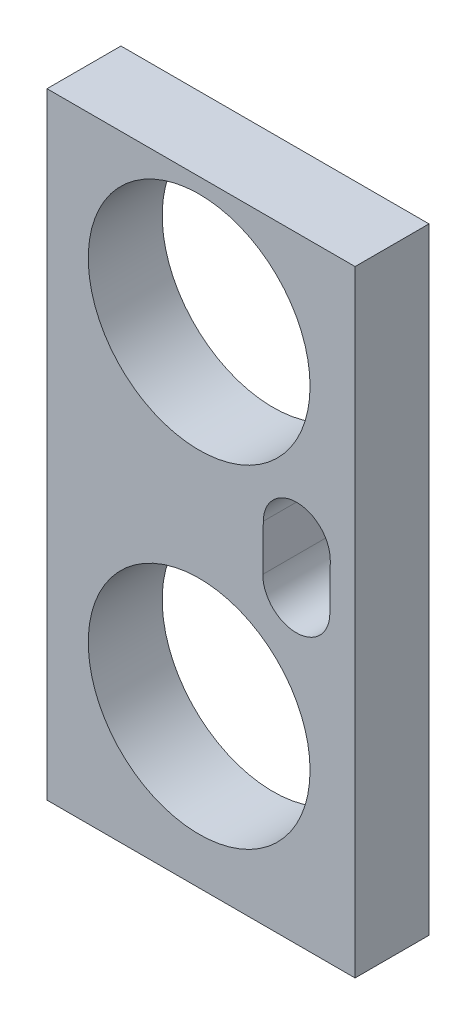
ISO-10303-21;
HEADER;
FILE_DESCRIPTION(('STEP AP214'),'2;1');
FILE_NAME('part.step','',(''),(''),'','','');
FILE_SCHEMA(('AUTOMOTIVE_DESIGN { 1 0 10303 214 1 1 1 1 }'));
ENDSEC;
DATA;
#1=APPLICATION_CONTEXT('core data for automotive mechanical design processes');
#2=APPLICATION_PROTOCOL_DEFINITION('international standard','automotive_design',2000,#1);
#3=PRODUCT_CONTEXT('',#1,'mechanical');
#4=PRODUCT('Part','Part','',(#3));
#5=PRODUCT_RELATED_PRODUCT_CATEGORY('part','',(#4));
#6=PRODUCT_DEFINITION_FORMATION('','',#4);
#7=PRODUCT_DEFINITION_CONTEXT('part definition',#1,'design');
#8=PRODUCT_DEFINITION('design','',#6,#7);
#9=PRODUCT_DEFINITION_SHAPE('','',#8);
#10=(LENGTH_UNIT() NAMED_UNIT(*) SI_UNIT(.MILLI.,.METRE.));
#11=(NAMED_UNIT(*) PLANE_ANGLE_UNIT() SI_UNIT($,.RADIAN.));
#12=(NAMED_UNIT(*) SI_UNIT($,.STERADIAN.) SOLID_ANGLE_UNIT());
#13=UNCERTAINTY_MEASURE_WITH_UNIT(LENGTH_MEASURE(1.E-05),#10,'distance_accuracy_value','');
#14=(GEOMETRIC_REPRESENTATION_CONTEXT(3) GLOBAL_UNCERTAINTY_ASSIGNED_CONTEXT((#13)) GLOBAL_UNIT_ASSIGNED_CONTEXT((#10,
#11,#12)) REPRESENTATION_CONTEXT('',''));
#15=CARTESIAN_POINT('',(0.,0.,0.));
#16=DIRECTION('',(0.,0.,1.));
#17=DIRECTION('',(1.,0.,0.));
#18=AXIS2_PLACEMENT_3D('',#15,#16,#17);
#19=CARTESIAN_POINT('',(-15.7894736842105,18.640350877193,6.));
#20=DIRECTION('',(1.,0.,0.));
#21=DIRECTION('',(0.,1.,0.));
#22=AXIS2_PLACEMENT_3D('',#19,#20,#21);
#23=PLANE('',#22);
#24=DIRECTION('',(0.,-1.,0.));
#25=VECTOR('',#24,1.);
#26=CARTESIAN_POINT('',(-15.7894736842105,18.640350877193,0.));
#27=LINE('',#26,#25);
#28=CARTESIAN_POINT('',(-15.7894736842105,18.640350877193,0.));
#29=VERTEX_POINT('',#28);
#30=CARTESIAN_POINT('',(-15.7894736842105,-31.359649122807,0.));
#31=VERTEX_POINT('',#30);
#32=EDGE_CURVE('E159',#29,#31,#27,.T.);
#33=ORIENTED_EDGE('',*,*,#32,.T.);
#34=DIRECTION('',(0.,0.,-1.));
#35=VECTOR('',#34,1.);
#36=CARTESIAN_POINT('',(-15.7894736842105,-31.359649122807,6.));
#37=LINE('',#36,#35);
#38=CARTESIAN_POINT('',(-15.7894736842105,-31.359649122807,6.));
#39=VERTEX_POINT('',#38);
#40=EDGE_CURVE('E11',#39,#31,#37,.T.);
#41=ORIENTED_EDGE('',*,*,#40,.F.);
#42=DIRECTION('',(0.,-1.,0.));
#43=VECTOR('',#42,1.);
#44=CARTESIAN_POINT('',(-15.7894736842105,18.640350877193,6.));
#45=LINE('',#44,#43);
#46=CARTESIAN_POINT('',(-15.7894736842105,18.640350877193,6.));
#47=VERTEX_POINT('',#46);
#48=EDGE_CURVE('E165',#47,#39,#45,.T.);
#49=ORIENTED_EDGE('',*,*,#48,.F.);
#50=DIRECTION('',(0.,0.,-1.));
#51=VECTOR('',#50,1.);
#52=CARTESIAN_POINT('',(-15.7894736842105,18.640350877193,6.));
#53=LINE('',#52,#51);
#54=EDGE_CURVE('E179',#47,#29,#53,.T.);
#55=ORIENTED_EDGE('',*,*,#54,.T.);
#56=EDGE_LOOP('',(#33,#41,#49,#55));
#57=FACE_BOUND('',#56,.T.);
#58=ADVANCED_FACE('F39',(#57),#23,.F.);
#59=CARTESIAN_POINT('',(-15.7894736842105,-31.359649122807,6.));
#60=DIRECTION('',(0.,1.,0.));
#61=DIRECTION('',(0.,0.,1.));
#62=AXIS2_PLACEMENT_3D('',#59,#60,#61);
#63=PLANE('',#62);
#64=DIRECTION('',(1.,0.,0.));
#65=VECTOR('',#64,1.);
#66=CARTESIAN_POINT('',(-15.7894736842105,-31.359649122807,0.));
#67=LINE('',#66,#65);
#68=CARTESIAN_POINT('',(9.2105263157895,-31.359649122807,0.));
#69=VERTEX_POINT('',#68);
#70=EDGE_CURVE('E183',#31,#69,#67,.T.);
#71=ORIENTED_EDGE('',*,*,#70,.T.);
#72=DIRECTION('',(0.,0.,-1.));
#73=VECTOR('',#72,1.);
#74=CARTESIAN_POINT('',(9.2105263157895,-31.359649122807,6.));
#75=LINE('',#74,#73);
#76=CARTESIAN_POINT('',(9.2105263157895,-31.359649122807,6.));
#77=VERTEX_POINT('',#76);
#78=EDGE_CURVE('E47',#77,#69,#75,.T.);
#79=ORIENTED_EDGE('',*,*,#78,.F.);
#80=DIRECTION('',(1.,0.,0.));
#81=VECTOR('',#80,1.);
#82=CARTESIAN_POINT('',(-15.7894736842105,-31.359649122807,6.));
#83=LINE('',#82,#81);
#84=EDGE_CURVE('E169',#39,#77,#83,.T.);
#85=ORIENTED_EDGE('',*,*,#84,.F.);
#86=ORIENTED_EDGE('',*,*,#40,.T.);
#87=EDGE_LOOP('',(#71,#79,#85,#86));
#88=FACE_BOUND('',#87,.T.);
#89=ADVANCED_FACE('F218',(#88),#63,.F.);
#90=CARTESIAN_POINT('',(9.21052631578949,18.640350877193,6.));
#91=DIRECTION('',(-1.,0.,0.));
#92=DIRECTION('',(0.,-1.,0.));
#93=AXIS2_PLACEMENT_3D('',#90,#91,#92);
#94=PLANE('',#93);
#95=DIRECTION('',(0.,1.,0.));
#96=VECTOR('',#95,1.);
#97=CARTESIAN_POINT('',(9.21052631578949,18.640350877193,0.));
#98=LINE('',#97,#96);
#99=CARTESIAN_POINT('',(9.21052631578949,18.640350877193,0.));
#100=VERTEX_POINT('',#99);
#101=EDGE_CURVE('E186',#69,#100,#98,.T.);
#102=ORIENTED_EDGE('',*,*,#101,.T.);
#103=DIRECTION('',(0.,0.,-1.));
#104=VECTOR('',#103,1.);
#105=CARTESIAN_POINT('',(9.21052631578949,18.640350877193,6.));
#106=LINE('',#105,#104);
#107=CARTESIAN_POINT('',(9.21052631578949,18.640350877193,6.));
#108=VERTEX_POINT('',#107);
#109=EDGE_CURVE('E194',#108,#100,#106,.T.);
#110=ORIENTED_EDGE('',*,*,#109,.F.);
#111=DIRECTION('',(0.,1.,0.));
#112=VECTOR('',#111,1.);
#113=CARTESIAN_POINT('',(9.21052631578949,18.640350877193,6.));
#114=LINE('',#113,#112);
#115=EDGE_CURVE('E173',#77,#108,#114,.T.);
#116=ORIENTED_EDGE('',*,*,#115,.F.);
#117=ORIENTED_EDGE('',*,*,#78,.T.);
#118=EDGE_LOOP('',(#102,#110,#116,#117));
#119=FACE_BOUND('',#118,.T.);
#120=ADVANCED_FACE('F203',(#119),#94,.F.);
#121=CARTESIAN_POINT('',(-15.7894736842105,18.640350877193,6.));
#122=DIRECTION('',(0.,-1.,0.));
#123=DIRECTION('',(0.,0.,-1.));
#124=AXIS2_PLACEMENT_3D('',#121,#122,#123);
#125=PLANE('',#124);
#126=DIRECTION('',(-1.,0.,0.));
#127=VECTOR('',#126,1.);
#128=CARTESIAN_POINT('',(-15.7894736842105,18.640350877193,0.));
#129=LINE('',#128,#127);
#130=EDGE_CURVE('E170',#100,#29,#129,.T.);
#131=ORIENTED_EDGE('',*,*,#130,.T.);
#132=ORIENTED_EDGE('',*,*,#54,.F.);
#133=DIRECTION('',(-1.,0.,0.));
#134=VECTOR('',#133,1.);
#135=CARTESIAN_POINT('',(-15.7894736842105,18.640350877193,6.));
#136=LINE('',#135,#134);
#137=EDGE_CURVE('E176',#108,#47,#136,.T.);
#138=ORIENTED_EDGE('',*,*,#137,.F.);
#139=ORIENTED_EDGE('',*,*,#109,.T.);
#140=EDGE_LOOP('',(#131,#132,#138,#139));
#141=FACE_BOUND('',#140,.T.);
#142=ADVANCED_FACE('F211',(#141),#125,.F.);
#143=CARTESIAN_POINT('',(0.,0.,6.));
#144=DIRECTION('',(0.,0.,1.));
#145=DIRECTION('',(1.,0.,0.));
#146=AXIS2_PLACEMENT_3D('',#143,#144,#145);
#147=PLANE('',#146);
#148=CARTESIAN_POINT('',(4.48071244725573,-3.01345239951454,6.));
#149=DIRECTION('',(0.,0.,1.));
#150=DIRECTION('',(1.,0.,0.));
#151=AXIS2_PLACEMENT_3D('',#148,#149,#150);
#152=CIRCLE('',#151,2.71901892867968);
#153=CARTESIAN_POINT('',(7.19958983040166,-3.04119604628132,6.));
#154=VERTEX_POINT('',#153);
#155=CARTESIAN_POINT('',(1.76183506410979,-2.98570875274776,6.));
#156=VERTEX_POINT('',#155);
#157=EDGE_CURVE('E54',#154,#156,#152,.T.);
#158=ORIENTED_EDGE('',*,*,#157,.F.);
#159=DIRECTION('',(0.0102035504328946,0.999947942424286,0.));
#160=VECTOR('',#159,1.);
#161=CARTESIAN_POINT('',(7.19958983040166,-3.04119604628132,6.));
#162=LINE('',#161,#160);
#163=CARTESIAN_POINT('',(7.16133244227247,-6.79042008294367,6.));
#164=VERTEX_POINT('',#163);
#165=EDGE_CURVE('E125',#164,#154,#162,.T.);
#166=ORIENTED_EDGE('',*,*,#165,.F.);
#167=CARTESIAN_POINT('',(4.44245505912654,-6.76267643617689,6.));
#168=DIRECTION('',(0.,0.,1.));
#169=DIRECTION('',(1.,0.,0.));
#170=AXIS2_PLACEMENT_3D('',#167,#168,#169);
#171=CIRCLE('',#170,2.71901892867968);
#172=CARTESIAN_POINT('',(1.72357767598061,-6.73493278941011,6.));
#173=VERTEX_POINT('',#172);
#174=EDGE_CURVE('E129',#173,#164,#171,.T.);
#175=ORIENTED_EDGE('',*,*,#174,.F.);
#176=DIRECTION('',(-0.0102035504328945,-0.999947942424286,0.));
#177=VECTOR('',#176,1.);
#178=CARTESIAN_POINT('',(1.76183506410979,-2.98570875274776,6.));
#179=LINE('',#178,#177);
#180=EDGE_CURVE('E141',#156,#173,#179,.T.);
#181=ORIENTED_EDGE('',*,*,#180,.F.);
#182=EDGE_LOOP('',(#158,#166,#175,#181));
#183=FACE_BOUND('',#182,.T.);
#184=CARTESIAN_POINT('',(-3.44225609457217,-18.5906827878457,6.));
#185=DIRECTION('',(0.,0.,1.));
#186=DIRECTION('',(1.,0.,0.));
#187=AXIS2_PLACEMENT_3D('',#184,#185,#186);
#188=CIRCLE('',#187,9.);
#189=CARTESIAN_POINT('',(5.55774390542783,-18.5906827878457,6.));
#190=VERTEX_POINT('',#189);
#191=EDGE_CURVE('E132',#190,#190,#188,.T.);
#192=ORIENTED_EDGE('',*,*,#191,.F.);
#193=EDGE_LOOP('',(#192));
#194=FACE_BOUND('',#193,.T.);
#195=CARTESIAN_POINT('',(-3.44225609457217,8.40931721215428,6.));
#196=DIRECTION('',(0.,0.,1.));
#197=DIRECTION('',(1.,0.,0.));
#198=AXIS2_PLACEMENT_3D('',#195,#196,#197);
#199=CIRCLE('',#198,9.);
#200=CARTESIAN_POINT('',(5.55774390542782,8.40931721215428,6.));
#201=VERTEX_POINT('',#200);
#202=EDGE_CURVE('E160',#201,#201,#199,.T.);
#203=ORIENTED_EDGE('',*,*,#202,.F.);
#204=EDGE_LOOP('',(#203));
#205=FACE_BOUND('',#204,.T.);
#206=ORIENTED_EDGE('',*,*,#48,.T.);
#207=ORIENTED_EDGE('',*,*,#84,.T.);
#208=ORIENTED_EDGE('',*,*,#115,.T.);
#209=ORIENTED_EDGE('',*,*,#137,.T.);
#210=EDGE_LOOP('',(#206,#207,#208,#209));
#211=FACE_BOUND('',#210,.T.);
#212=ADVANCED_FACE('F217',(#183,#194,#205,#211),#147,.T.);
#213=CARTESIAN_POINT('',(0.,0.,0.));
#214=DIRECTION('',(0.,0.,1.));
#215=DIRECTION('',(1.,0.,0.));
#216=AXIS2_PLACEMENT_3D('',#213,#214,#215);
#217=PLANE('',#216);
#218=DIRECTION('',(0.0102035504328946,0.999947942424286,0.));
#219=VECTOR('',#218,1.);
#220=CARTESIAN_POINT('',(7.19958983040166,-3.04119604628132,0.));
#221=LINE('',#220,#219);
#222=CARTESIAN_POINT('',(7.16133244227247,-6.79042008294367,0.));
#223=VERTEX_POINT('',#222);
#224=CARTESIAN_POINT('',(7.19958983040166,-3.04119604628132,0.));
#225=VERTEX_POINT('',#224);
#226=EDGE_CURVE('E113',#223,#225,#221,.T.);
#227=ORIENTED_EDGE('',*,*,#226,.T.);
#228=CARTESIAN_POINT('',(4.48071244725573,-3.01345239951454,0.));
#229=DIRECTION('',(0.,0.,1.));
#230=DIRECTION('',(1.,0.,0.));
#231=AXIS2_PLACEMENT_3D('',#228,#229,#230);
#232=CIRCLE('',#231,2.71901892867968);
#233=CARTESIAN_POINT('',(1.76183506410979,-2.98570875274776,0.));
#234=VERTEX_POINT('',#233);
#235=EDGE_CURVE('E106',#225,#234,#232,.T.);
#236=ORIENTED_EDGE('',*,*,#235,.T.);
#237=DIRECTION('',(-0.0102035504328945,-0.999947942424286,0.));
#238=VECTOR('',#237,1.);
#239=CARTESIAN_POINT('',(1.76183506410979,-2.98570875274776,0.));
#240=LINE('',#239,#238);
#241=CARTESIAN_POINT('',(1.72357767598061,-6.73493278941011,0.));
#242=VERTEX_POINT('',#241);
#243=EDGE_CURVE('E116',#234,#242,#240,.T.);
#244=ORIENTED_EDGE('',*,*,#243,.T.);
#245=CARTESIAN_POINT('',(4.44245505912654,-6.76267643617689,0.));
#246=DIRECTION('',(0.,0.,1.));
#247=DIRECTION('',(1.,0.,0.));
#248=AXIS2_PLACEMENT_3D('',#245,#246,#247);
#249=CIRCLE('',#248,2.71901892867968);
#250=EDGE_CURVE('E62',#242,#223,#249,.T.);
#251=ORIENTED_EDGE('',*,*,#250,.T.);
#252=EDGE_LOOP('',(#227,#236,#244,#251));
#253=FACE_BOUND('',#252,.T.);
#254=CARTESIAN_POINT('',(-3.44225609457217,-18.5906827878457,0.));
#255=DIRECTION('',(0.,0.,1.));
#256=DIRECTION('',(1.,0.,0.));
#257=AXIS2_PLACEMENT_3D('',#254,#255,#256);
#258=CIRCLE('',#257,9.);
#259=CARTESIAN_POINT('',(5.55774390542783,-18.5906827878457,0.));
#260=VERTEX_POINT('',#259);
#261=EDGE_CURVE('E164',#260,#260,#258,.T.);
#262=ORIENTED_EDGE('',*,*,#261,.T.);
#263=EDGE_LOOP('',(#262));
#264=FACE_BOUND('',#263,.T.);
#265=CARTESIAN_POINT('',(-3.44225609457217,8.40931721215428,0.));
#266=DIRECTION('',(0.,0.,1.));
#267=DIRECTION('',(1.,0.,0.));
#268=AXIS2_PLACEMENT_3D('',#265,#266,#267);
#269=CIRCLE('',#268,9.);
#270=CARTESIAN_POINT('',(5.55774390542782,8.40931721215428,0.));
#271=VERTEX_POINT('',#270);
#272=EDGE_CURVE('E155',#271,#271,#269,.T.);
#273=ORIENTED_EDGE('',*,*,#272,.T.);
#274=EDGE_LOOP('',(#273));
#275=FACE_BOUND('',#274,.T.);
#276=ORIENTED_EDGE('',*,*,#32,.F.);
#277=ORIENTED_EDGE('',*,*,#130,.F.);
#278=ORIENTED_EDGE('',*,*,#101,.F.);
#279=ORIENTED_EDGE('',*,*,#70,.F.);
#280=EDGE_LOOP('',(#276,#277,#278,#279));
#281=FACE_BOUND('',#280,.T.);
#282=ADVANCED_FACE('F121',(#253,#264,#275,#281),#217,.F.);
#283=CARTESIAN_POINT('',(-3.44225609457217,8.40931721215428,0.));
#284=DIRECTION('',(0.,0.,1.));
#285=DIRECTION('',(1.,0.,0.));
#286=AXIS2_PLACEMENT_3D('',#283,#284,#285);
#287=CYLINDRICAL_SURFACE('',#286,9.);
#288=ORIENTED_EDGE('',*,*,#272,.F.);
#289=EDGE_LOOP('',(#288));
#290=FACE_BOUND('',#289,.T.);
#291=ORIENTED_EDGE('',*,*,#202,.T.);
#292=EDGE_LOOP('',(#291));
#293=FACE_BOUND('',#292,.T.);
#294=ADVANCED_FACE('F230',(#290,#293),#287,.F.);
#295=CARTESIAN_POINT('',(-3.44225609457217,-18.5906827878457,0.));
#296=DIRECTION('',(0.,0.,1.));
#297=DIRECTION('',(1.,0.,0.));
#298=AXIS2_PLACEMENT_3D('',#295,#296,#297);
#299=CYLINDRICAL_SURFACE('',#298,9.);
#300=ORIENTED_EDGE('',*,*,#261,.F.);
#301=EDGE_LOOP('',(#300));
#302=FACE_BOUND('',#301,.T.);
#303=ORIENTED_EDGE('',*,*,#191,.T.);
#304=EDGE_LOOP('',(#303));
#305=FACE_BOUND('',#304,.T.);
#306=ADVANCED_FACE('F236',(#302,#305),#299,.F.);
#307=CARTESIAN_POINT('',(4.48071244725573,-3.01345239951454,0.));
#308=DIRECTION('',(0.,0.,1.));
#309=DIRECTION('',(1.,0.,0.));
#310=AXIS2_PLACEMENT_3D('',#307,#308,#309);
#311=CYLINDRICAL_SURFACE('',#310,2.71901892867968);
#312=ORIENTED_EDGE('',*,*,#157,.T.);
#313=DIRECTION('',(0.,0.,1.));
#314=VECTOR('',#313,1.);
#315=CARTESIAN_POINT('',(1.76183506410979,-2.98570875274776,0.));
#316=LINE('',#315,#314);
#317=EDGE_CURVE('E102',#234,#156,#316,.T.);
#318=ORIENTED_EDGE('',*,*,#317,.F.);
#319=ORIENTED_EDGE('',*,*,#235,.F.);
#320=DIRECTION('',(0.,0.,1.));
#321=VECTOR('',#320,1.);
#322=CARTESIAN_POINT('',(7.19958983040166,-3.04119604628132,0.));
#323=LINE('',#322,#321);
#324=EDGE_CURVE('E147',#225,#154,#323,.T.);
#325=ORIENTED_EDGE('',*,*,#324,.T.);
#326=EDGE_LOOP('',(#312,#318,#319,#325));
#327=FACE_BOUND('',#326,.T.);
#328=ADVANCED_FACE('F104',(#327),#311,.F.);
#329=CARTESIAN_POINT('',(7.19958983040166,-3.04119604628132,0.));
#330=DIRECTION('',(0.999947942424286,-0.0102035504328946,0.));
#331=DIRECTION('',(0.0102035504328946,0.999947942424286,0.));
#332=AXIS2_PLACEMENT_3D('',#329,#330,#331);
#333=PLANE('',#332);
#334=ORIENTED_EDGE('',*,*,#165,.T.);
#335=ORIENTED_EDGE('',*,*,#324,.F.);
#336=ORIENTED_EDGE('',*,*,#226,.F.);
#337=DIRECTION('',(0.,0.,1.));
#338=VECTOR('',#337,1.);
#339=CARTESIAN_POINT('',(7.16133244227247,-6.79042008294367,0.));
#340=LINE('',#339,#338);
#341=EDGE_CURVE('E150',#223,#164,#340,.T.);
#342=ORIENTED_EDGE('',*,*,#341,.T.);
#343=EDGE_LOOP('',(#334,#335,#336,#342));
#344=FACE_BOUND('',#343,.T.);
#345=ADVANCED_FACE('F240',(#344),#333,.F.);
#346=CARTESIAN_POINT('',(4.44245505912654,-6.76267643617689,0.));
#347=DIRECTION('',(0.,0.,1.));
#348=DIRECTION('',(1.,0.,0.));
#349=AXIS2_PLACEMENT_3D('',#346,#347,#348);
#350=CYLINDRICAL_SURFACE('',#349,2.71901892867968);
#351=ORIENTED_EDGE('',*,*,#174,.T.);
#352=ORIENTED_EDGE('',*,*,#341,.F.);
#353=ORIENTED_EDGE('',*,*,#250,.F.);
#354=DIRECTION('',(0.,0.,1.));
#355=VECTOR('',#354,1.);
#356=CARTESIAN_POINT('',(1.72357767598061,-6.73493278941011,0.));
#357=LINE('',#356,#355);
#358=EDGE_CURVE('E112',#242,#173,#357,.T.);
#359=ORIENTED_EDGE('',*,*,#358,.T.);
#360=EDGE_LOOP('',(#351,#352,#353,#359));
#361=FACE_BOUND('',#360,.T.);
#362=ADVANCED_FACE('F243',(#361),#350,.F.);
#363=CARTESIAN_POINT('',(1.76183506410979,-2.98570875274776,0.));
#364=DIRECTION('',(-0.999947942424286,0.0102035504328945,0.));
#365=DIRECTION('',(-0.0102035504328945,-0.999947942424286,0.));
#366=AXIS2_PLACEMENT_3D('',#363,#364,#365);
#367=PLANE('',#366);
#368=ORIENTED_EDGE('',*,*,#180,.T.);
#369=ORIENTED_EDGE('',*,*,#358,.F.);
#370=ORIENTED_EDGE('',*,*,#243,.F.);
#371=ORIENTED_EDGE('',*,*,#317,.T.);
#372=EDGE_LOOP('',(#368,#369,#370,#371));
#373=FACE_BOUND('',#372,.T.);
#374=ADVANCED_FACE('F117',(#373),#367,.F.);
#375=CLOSED_SHELL('',(#58,#89,#120,#142,#212,#282,#294,#306,#328,#345,#362,#374));
#376=MANIFOLD_SOLID_BREP('B2',#375);
#377=ADVANCED_BREP_SHAPE_REPRESENTATION('',(#18,#376),#14);
#378=SHAPE_DEFINITION_REPRESENTATION(#9,#377);
ENDSEC;
END-ISO-10303-21;
